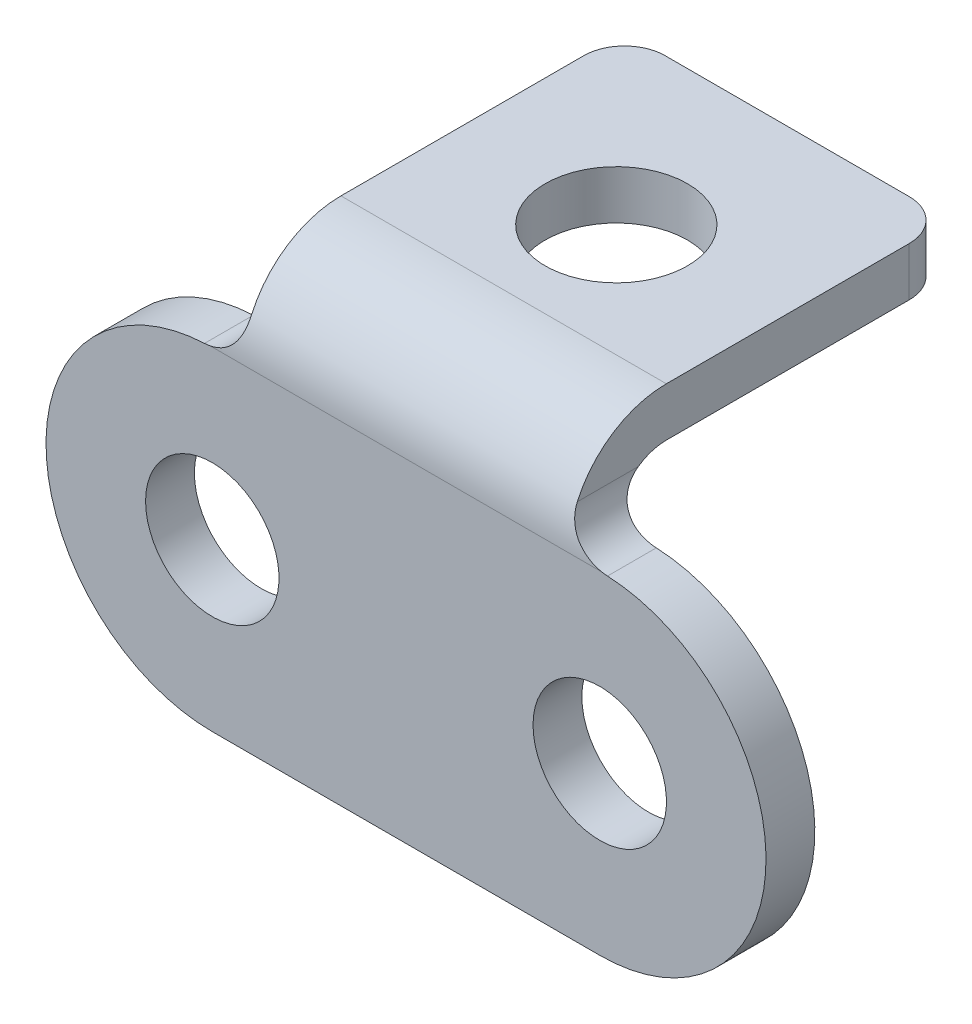
ISO-10303-21;
HEADER;
FILE_DESCRIPTION(('STEP AP214'),'2;1');
FILE_NAME('part.step','',(''),(''),'','','');
FILE_SCHEMA(('AUTOMOTIVE_DESIGN { 1 0 10303 214 1 1 1 1 }'));
ENDSEC;
DATA;
#1=APPLICATION_CONTEXT('core data for automotive mechanical design processes');
#2=APPLICATION_PROTOCOL_DEFINITION('international standard','automotive_design',2000,#1);
#3=PRODUCT_CONTEXT('',#1,'mechanical');
#4=PRODUCT('Part','Part','',(#3));
#5=PRODUCT_RELATED_PRODUCT_CATEGORY('part','',(#4));
#6=PRODUCT_DEFINITION_FORMATION('','',#4);
#7=PRODUCT_DEFINITION_CONTEXT('part definition',#1,'design');
#8=PRODUCT_DEFINITION('design','',#6,#7);
#9=PRODUCT_DEFINITION_SHAPE('','',#8);
#10=(LENGTH_UNIT() NAMED_UNIT(*) SI_UNIT(.MILLI.,.METRE.));
#11=(NAMED_UNIT(*) PLANE_ANGLE_UNIT() SI_UNIT($,.RADIAN.));
#12=(NAMED_UNIT(*) SI_UNIT($,.STERADIAN.) SOLID_ANGLE_UNIT());
#13=UNCERTAINTY_MEASURE_WITH_UNIT(LENGTH_MEASURE(1.E-05),#10,'distance_accuracy_value','');
#14=(GEOMETRIC_REPRESENTATION_CONTEXT(3) GLOBAL_UNCERTAINTY_ASSIGNED_CONTEXT((#13)) GLOBAL_UNIT_ASSIGNED_CONTEXT((#10,
#11,#12)) REPRESENTATION_CONTEXT('',''));
#15=CARTESIAN_POINT('',(0.,0.,0.));
#16=DIRECTION('',(0.,0.,1.));
#17=DIRECTION('',(1.,0.,0.));
#18=AXIS2_PLACEMENT_3D('',#15,#16,#17);
#19=CARTESIAN_POINT('',(37.3375,6.5,-18.03));
#20=DIRECTION('',(-1.,0.,0.));
#21=DIRECTION('',(0.,0.,1.));
#22=AXIS2_PLACEMENT_3D('',#19,#20,#21);
#23=PLANE('',#22);
#24=DIRECTION('',(0.,0.,1.));
#25=VECTOR('',#24,1.);
#26=CARTESIAN_POINT('',(37.3375,5.08195336460302,-18.03));
#27=LINE('',#26,#25);
#28=CARTESIAN_POINT('',(37.3375,5.08195336460302,-6.04024091905592));
#29=VERTEX_POINT('',#28);
#30=CARTESIAN_POINT('',(37.3375,5.08195336460302,-4.54007589406738));
#31=VERTEX_POINT('',#30);
#32=EDGE_CURVE('E11',#29,#31,#27,.T.);
#33=ORIENTED_EDGE('',*,*,#32,.F.);
#34=CARTESIAN_POINT('',(37.3375,4.1,-6.73));
#35=DIRECTION('',(-1.,0.,0.));
#36=DIRECTION('',(0.,0.,1.));
#37=AXIS2_PLACEMENT_3D('',#34,#35,#36);
#38=CIRCLE('',#37,1.2);
#39=CARTESIAN_POINT('',(37.3375,5.3,-6.73));
#40=VERTEX_POINT('',#39);
#41=EDGE_CURVE('E190',#29,#40,#38,.T.);
#42=ORIENTED_EDGE('',*,*,#41,.T.);
#43=DIRECTION('',(0.,0.,1.));
#44=VECTOR('',#43,1.);
#45=CARTESIAN_POINT('',(37.3375,5.3,-13.7));
#46=LINE('',#45,#44);
#47=CARTESIAN_POINT('',(37.3375,5.3,-12.7));
#48=VERTEX_POINT('',#47);
#49=EDGE_CURVE('E168',#48,#40,#46,.T.);
#50=ORIENTED_EDGE('',*,*,#49,.F.);
#51=DIRECTION('',(0.,-1.,0.));
#52=VECTOR('',#51,1.);
#53=CARTESIAN_POINT('',(37.3375,6.5,-12.7));
#54=LINE('',#53,#52);
#55=CARTESIAN_POINT('',(37.3375,6.5,-12.7));
#56=VERTEX_POINT('',#55);
#57=EDGE_CURVE('E430',#56,#48,#54,.T.);
#58=ORIENTED_EDGE('',*,*,#57,.F.);
#59=DIRECTION('',(0.,0.,1.));
#60=VECTOR('',#59,1.);
#61=CARTESIAN_POINT('',(37.3375,6.5,-18.03));
#62=LINE('',#61,#60);
#63=CARTESIAN_POINT('',(37.3375,6.5,-6.73));
#64=VERTEX_POINT('',#63);
#65=EDGE_CURVE('E217',#56,#64,#62,.T.);
#66=ORIENTED_EDGE('',*,*,#65,.T.);
#67=CARTESIAN_POINT('',(37.3375,4.1,-6.73));
#68=DIRECTION('',(-1.,0.,0.));
#69=DIRECTION('',(0.,0.,1.));
#70=AXIS2_PLACEMENT_3D('',#67,#68,#69);
#71=CIRCLE('',#70,2.4);
#72=EDGE_CURVE('E197',#31,#64,#71,.T.);
#73=ORIENTED_EDGE('',*,*,#72,.F.);
#74=EDGE_LOOP('',(#33,#42,#50,#58,#66,#73));
#75=FACE_BOUND('',#74,.T.);
#76=ADVANCED_FACE('F16',(#75),#23,.F.);
#77=CARTESIAN_POINT('',(38.3375,5.08195336460302,-18.03));
#78=DIRECTION('',(0.,0.,-1.));
#79=DIRECTION('',(1.,0.,0.));
#80=AXIS2_PLACEMENT_3D('',#77,#78,#79);
#81=CYLINDRICAL_SURFACE('',#80,1.);
#82=ORIENTED_EDGE('',*,*,#32,.T.);
#83=CARTESIAN_POINT('',(37.3375,5.08195336460302,-4.54007589406738));
#84=CARTESIAN_POINT('',(37.3374996973991,5.06906405721855,-4.5342962223887));
#85=CARTESIAN_POINT('',(37.3377491940562,5.05611595640548,-4.528647029245));
#86=CARTESIAN_POINT('',(37.3387608609191,5.03008658764226,-4.51759112880695));
#87=CARTESIAN_POINT('',(37.3395247020527,5.01700502295884,-4.51218527329103));
#88=CARTESIAN_POINT('',(37.3415820415878,4.99072973420558,-4.50161603465415));
#89=CARTESIAN_POINT('',(37.3428774650514,4.97753577497007,-4.49645360964719));
#90=CARTESIAN_POINT('',(37.3460137847147,4.95105832170342,-4.48637110176577));
#91=CARTESIAN_POINT('',(37.3478568606397,4.93777468120795,-4.48145208070424));
#92=CARTESIAN_POINT('',(37.3521036118509,4.911141780993,-4.47185628480021));
#93=CARTESIAN_POINT('',(37.3545097215617,4.89779249004755,-4.46718067289324));
#94=CARTESIAN_POINT('',(37.3598967262858,4.87105357615684,-4.45807159356169));
#95=CARTESIAN_POINT('',(37.3628803072728,4.85766406440438,-4.45363938702716));
#96=CARTESIAN_POINT('',(37.3694354413794,4.83087133150614,-4.44501702247237));
#97=CARTESIAN_POINT('',(37.3730099264246,4.81746839110454,-4.44082821978433));
#98=CARTESIAN_POINT('',(37.3807589425511,4.79067674628369,-4.43269256924296));
#99=CARTESIAN_POINT('',(37.3849366432181,4.77728851912609,-4.42874716728435));
#100=CARTESIAN_POINT('',(37.3939029500898,4.75055554122746,-4.42109823136776));
#101=CARTESIAN_POINT('',(37.3986949526312,4.73721149077756,-4.41739622970685));
#102=CARTESIAN_POINT('',(37.4088994002627,4.71059737034304,-4.41023400156694));
#103=CARTESIAN_POINT('',(37.4143154549227,4.69732824951201,-4.40677538929229));
#104=CARTESIAN_POINT('',(37.4257761163996,4.67089571198451,-4.40009989001131));
#105=CARTESIAN_POINT('',(37.431824529977,4.65773351819093,-4.39688469471324));
#106=CARTESIAN_POINT('',(37.4445564718395,4.63154774326279,-4.39069583950371));
#107=CARTESIAN_POINT('',(37.4512439854982,4.61852568260414,-4.38772394304087));
#108=CARTESIAN_POINT('',(37.4652590736037,4.59265416061496,-4.3820220457293));
#109=CARTESIAN_POINT('',(37.4725907913668,4.57980653944685,-4.37929387888681));
#110=CARTESIAN_POINT('',(37.487897356661,4.55431908626955,-4.37407774985145));
#111=CARTESIAN_POINT('',(37.4958764814592,4.54168143599784,-4.37159167251528));
#112=CARTESIAN_POINT('',(37.5124795136618,4.51664952770522,-4.36686579318819));
#113=CARTESIAN_POINT('',(37.5211078103676,4.50425780785585,-4.36462797932352));
#114=CARTESIAN_POINT('',(37.5390071644361,4.47975639670014,-4.36037543008516));
#115=CARTESIAN_POINT('',(37.5482826828944,4.46764963347198,-4.35836255693414));
#116=CARTESIAN_POINT('',(37.5637052301297,4.44844778968799,-4.35537757067546));
#117=CARTESIAN_POINT('',(37.5696748023985,4.44122532646264,-4.35430402140324));
#118=CARTESIAN_POINT('',(37.5822723426644,4.42641350057514,-4.35222574986562));
#119=CARTESIAN_POINT('',(37.5889164211071,4.4188362912079,-4.35123191948807));
#120=CARTESIAN_POINT('',(37.6029032667057,4.40336382144328,-4.34930077310651));
#121=CARTESIAN_POINT('',(37.6102626580143,4.39548253290462,-4.34837204619443));
#122=CARTESIAN_POINT('',(37.6257223217862,4.37945470246143,-4.3465763210239));
#123=CARTESIAN_POINT('',(37.6338397643776,4.37132383912001,-4.3457171678245));
#124=CARTESIAN_POINT('',(37.6508570105788,4.35485641073106,-4.34406031983187));
#125=CARTESIAN_POINT('',(37.6597743944715,4.34653731919383,-4.34326952142754));
#126=CARTESIAN_POINT('',(37.6784321594206,4.3297593229954,-4.34175053196379));
#127=CARTESIAN_POINT('',(37.6881904167751,4.32131973362927,-4.34102852709819));
#128=CARTESIAN_POINT('',(37.7085687467369,4.30437346867442,-4.33964769213878));
#129=CARTESIAN_POINT('',(37.7192068481031,4.29588801581417,-4.33899441816961));
#130=CARTESIAN_POINT('',(37.7413810332253,4.27892976126298,-4.33775165032335));
#131=CARTESIAN_POINT('',(37.7529351402625,4.27048015204338,-4.33716717899792));
#132=CARTESIAN_POINT('',(37.7769738703768,4.2536805239499,-4.33606250272444));
#133=CARTESIAN_POINT('',(37.7894763352889,4.24535572770696,-4.3355468573742));
#134=CARTESIAN_POINT('',(37.8154396353933,4.22889995346314,-4.33458026507325));
#135=CARTESIAN_POINT('',(37.8289179383359,4.22079628212176,-4.334133475704));
#136=CARTESIAN_POINT('',(37.8568549584854,4.20488427277453,-4.33330496895582));
#137=CARTESIAN_POINT('',(37.8713305600609,4.19710537011953,-4.33292705735343));
#138=CARTESIAN_POINT('',(37.9012772057827,4.18195157512225,-4.33223663620648));
#139=CARTESIAN_POINT('',(37.9167643253952,4.17460827882029,-4.33192762313988));
#140=CARTESIAN_POINT('',(37.9487407529076,4.16044130252113,-4.33137528424527));
#141=CARTESIAN_POINT('',(37.9652450864807,4.15365139666839,-4.3311351812491));
#142=CARTESIAN_POINT('',(37.9992530573989,4.14071324664489,-4.33072093784856));
#143=CARTESIAN_POINT('',(38.0167704142487,4.13460095021264,-4.33054977817493));
#144=CARTESIAN_POINT('',(38.0527906221591,4.12314624973234,-4.33027357721504));
#145=CARTESIAN_POINT('',(38.0713056196778,4.11784195363584,-4.3301712972412));
#146=CARTESIAN_POINT('',(38.1092946749021,4.10813560847035,-4.33003334792781));
#147=CARTESIAN_POINT('',(38.1287790157694,4.1037737406812,-4.33000025662574));
#148=CARTESIAN_POINT('',(38.1483767868695,4.1,-4.33));
#149=B_SPLINE_CURVE_WITH_KNOTS('',3,(#83,#84,#85,#86,#87,#88,#89,#90,#91,#92,#93,#94,#95,#96,
#97,#98,#99,#100,#101,#102,#103,#104,#105,#106,#107,#108,#109,#110,#111,#112,#113,#114,#115,
#116,#117,#118,#119,#120,#121,#122,#123,#124,#125,#126,#127,#128,#129,#130,#131,#132,#133,#134,
#135,#136,#137,#138,#139,#140,#141,#142,#143,#144,#145,#146,#147,#148),.UNSPECIFIED.,.F.,.F.,(4,
2,2,2,2,2,2,2,2,2,2,2,2,2,2,2,2,2,2,2,2,2,2,2,2,2,2,2,2,2,2,2,4),(0.,0.0423749285428994,
0.0848881870294179,0.127556780281232,0.170397528058938,0.213427048153157,0.25666174059294,
0.300117773024002,0.343811067295968,0.387757287284385,0.431971827960584,0.476469805710315,
0.521266049890743,0.566375095605169,0.611811177665525,0.657588225704567,0.70371986039276,
0.732009982734578,0.762383610428787,0.794846419777004,0.829403048988322,0.866057332776642,
0.904812474487893,0.945671174599992,0.988635728159306,1.03370809970899,1.08088998164802,
1.13018284021527,1.18158795210891,1.23510643393302,1.29073926608892,1.34848731232003,
1.40835133582318),.UNSPECIFIED.);
#150=CARTESIAN_POINT('',(38.1483767868695,4.1,-4.33));
#151=VERTEX_POINT('',#150);
#152=EDGE_CURVE('E329',#31,#151,#149,.T.);
#153=ORIENTED_EDGE('',*,*,#152,.T.);
#154=CARTESIAN_POINT('',(38.3375,5.08195336460302,-4.33));
#155=DIRECTION('',(0.,0.,-1.));
#156=DIRECTION('',(-1.,0.,0.));
#157=AXIS2_PLACEMENT_3D('',#154,#155,#156);
#158=CIRCLE('',#157,1.);
#159=CARTESIAN_POINT('',(38.2908169322665,4.08304361333067,-4.33));
#160=VERTEX_POINT('',#159);
#161=EDGE_CURVE('E264',#160,#151,#158,.T.);
#162=ORIENTED_EDGE('',*,*,#161,.F.);
#163=DIRECTION('',(0.,0.,1.));
#164=VECTOR('',#163,1.);
#165=CARTESIAN_POINT('',(38.2908169322665,4.08304361333067,-18.03));
#166=LINE('',#165,#164);
#167=CARTESIAN_POINT('',(38.2908169322665,4.08304361333067,-5.53));
#168=VERTEX_POINT('',#167);
#169=EDGE_CURVE('E211',#168,#160,#166,.T.);
#170=ORIENTED_EDGE('',*,*,#169,.F.);
#171=CARTESIAN_POINT('',(38.3375,5.08195336460302,-5.53));
#172=DIRECTION('',(0.,0.,-1.));
#173=DIRECTION('',(0.,1.,0.));
#174=AXIS2_PLACEMENT_3D('',#171,#172,#173);
#175=CIRCLE('',#174,1.);
#176=CARTESIAN_POINT('',(38.1483767868695,4.1,-5.53));
#177=VERTEX_POINT('',#176);
#178=EDGE_CURVE('E175',#168,#177,#175,.T.);
#179=ORIENTED_EDGE('',*,*,#178,.T.);
#180=CARTESIAN_POINT('',(37.3375,5.08195336460302,-6.04024091905593));
#181=CARTESIAN_POINT('',(37.3375005865883,5.07105848050952,-6.02472929654194));
#182=CARTESIAN_POINT('',(37.3377324115394,5.05979417986858,-6.00947605278365));
#183=CARTESIAN_POINT('',(37.3386853080608,5.03685158942023,-5.97989990576452));
#184=CARTESIAN_POINT('',(37.3393941467266,5.02519041110512,-5.96556332644786));
#185=CARTESIAN_POINT('',(37.3413006554633,5.0015312213631,-5.93780946128447));
#186=CARTESIAN_POINT('',(37.3424858587477,4.9895485747764,-5.924378231615));
#187=CARTESIAN_POINT('',(37.3453455205969,4.96532117293338,-5.89841916526716));
#188=CARTESIAN_POINT('',(37.3470073061036,4.95308999297588,-5.8858772688395));
#189=CARTESIAN_POINT('',(37.3508202761959,4.92843586716751,-5.86167683113589));
#190=CARTESIAN_POINT('',(37.3529586480234,4.91602471974523,-5.85000425959707));
#191=CARTESIAN_POINT('',(37.357724927606,4.89107701036142,-5.82751875780691));
#192=CARTESIAN_POINT('',(37.3603399559695,4.87855048424908,-5.81669197108341));
#193=CARTESIAN_POINT('',(37.3660595904246,4.85343421639884,-5.79587114887218));
#194=CARTESIAN_POINT('',(37.3691513395947,4.84085277996967,-5.78586357191326));
#195=CARTESIAN_POINT('',(37.3758243678718,4.81568476681536,-5.76665156375046));
#196=CARTESIAN_POINT('',(37.3793929158667,4.80310481333488,-5.75743404376635));
#197=CARTESIAN_POINT('',(37.3870193798879,4.77799373496137,-5.73977026726667));
#198=CARTESIAN_POINT('',(37.3910648086391,4.76546761985401,-5.73131150762922));
#199=CARTESIAN_POINT('',(37.3996447608289,4.74051414764841,-5.71513150943699));
#200=CARTESIAN_POINT('',(37.4041671718119,4.72809027796722,-5.70739848002039));
#201=CARTESIAN_POINT('',(37.4137006319242,4.70338722708816,-5.69263471456062));
#202=CARTESIAN_POINT('',(37.4187000866547,4.69111012833905,-5.68559301842812));
#203=CARTESIAN_POINT('',(37.4291871945416,4.66674277921686,-5.67217561615306));
#204=CARTESIAN_POINT('',(37.4346639179318,4.65465334907107,-5.66578988734188));
#205=CARTESIAN_POINT('',(37.4461043707082,4.6306993613657,-5.65364720772937));
#206=CARTESIAN_POINT('',(37.4520579978101,4.61883454264007,-5.64788126740417));
#207=CARTESIAN_POINT('',(37.464453083593,4.59536552711423,-5.63694097919118));
#208=CARTESIAN_POINT('',(37.4708853799885,4.58376016908151,-5.63175874278178));
#209=CARTESIAN_POINT('',(37.4842305635714,4.56083737265123,-5.62194673502916));
#210=CARTESIAN_POINT('',(37.4911354812212,4.54951817694782,-5.61731025690194));
#211=CARTESIAN_POINT('',(37.5054474466195,4.52720975266503,-5.6085572151849));
#212=CARTESIAN_POINT('',(37.5128474637027,4.51621819350492,-5.60443507367007));
#213=CARTESIAN_POINT('',(37.5296574450734,4.4922690700007,-5.59584069389036));
#214=CARTESIAN_POINT('',(37.5391749637117,4.47935393946035,-5.59146116501471));
#215=CARTESIAN_POINT('',(37.5586767275259,4.45401792219475,-5.58333298744111));
#216=CARTESIAN_POINT('',(37.5686514141635,4.44159247293994,-5.57957558780936));
#217=CARTESIAN_POINT('',(37.589093038291,4.41728506037996,-5.57263750245437));
#218=CARTESIAN_POINT('',(37.5995515235942,4.40539802758377,-5.56944972280021));
#219=CARTESIAN_POINT('',(37.620952113806,4.38219041028102,-5.56359092064408));
#220=CARTESIAN_POINT('',(37.631887467712,4.37086496324978,-5.56091449635717));
#221=CARTESIAN_POINT('',(37.6542419728143,4.34880439208979,-5.55602259999871));
#222=CARTESIAN_POINT('',(37.6656560143386,4.33806494702842,-5.55380327549249));
#223=CARTESIAN_POINT('',(37.6889657008852,4.31719459854231,-5.54977173090808));
#224=CARTESIAN_POINT('',(37.7008578940625,4.30706031431039,-5.54795705557359));
#225=CARTESIAN_POINT('',(37.7251223302756,4.28741513268255,-5.5446838413663));
#226=CARTESIAN_POINT('',(37.7374927062667,4.27790213729634,-5.54322405318047));
#227=CARTESIAN_POINT('',(37.7627118804669,4.2595109655029,-5.54061256900007));
#228=CARTESIAN_POINT('',(37.7755602695673,4.2506322644129,-5.53946061615315));
#229=CARTESIAN_POINT('',(37.8017340335749,4.23351827208645,-5.53741990028186));
#230=CARTESIAN_POINT('',(37.8150602770954,4.22528424918848,-5.53653164693166));
#231=CARTESIAN_POINT('',(37.8421885016079,4.20946576391798,-5.53497668826272));
#232=CARTESIAN_POINT('',(37.8559924079764,4.20188450281663,-5.53431103322666));
#233=CARTESIAN_POINT('',(37.8840749479823,4.1873756828105,-5.5331629825576));
#234=CARTESIAN_POINT('',(37.898356316752,4.18045331459699,-5.53268196389156));
#235=CARTESIAN_POINT('',(37.9273930350584,4.16726480125818,-5.53186831578657));
#236=CARTESIAN_POINT('',(37.9421516726641,4.16100581205905,-5.53153719873428));
#237=CARTESIAN_POINT('',(37.9721424217064,4.14914534909203,-5.53099189896257));
#238=CARTESIAN_POINT('',(37.9873781227963,4.14355290058387,-5.53077920322703));
#239=CARTESIAN_POINT('',(38.0183228339156,4.13302581740285,-5.53044283611062));
#240=CARTESIAN_POINT('',(38.0340355045395,4.12810192119342,-5.53032050312862));
#241=CARTESIAN_POINT('',(38.0659338757137,4.11891189647762,-5.53014001770664));
#242=CARTESIAN_POINT('',(38.0821230998427,4.11465802562399,-5.53008296286789));
#243=CARTESIAN_POINT('',(38.1149758050224,4.10680652564628,-5.530013027532));
#244=CARTESIAN_POINT('',(38.1316425288745,4.1032224282545,-5.5300009801096));
#245=CARTESIAN_POINT('',(38.1483767868695,4.1,-5.53));
#246=B_SPLINE_CURVE_WITH_KNOTS('',3,(#180,#181,#182,#183,#184,#185,#186,#187,#188,#189,#190,
#191,#192,#193,#194,#195,#196,#197,#198,#199,#200,#201,#202,#203,#204,#205,#206,#207,#208,#209,
#210,#211,#212,#213,#214,#215,#216,#217,#218,#219,#220,#221,#222,#223,#224,#225,#226,#227,#228,
#229,#230,#231,#232,#233,#234,#235,#236,#237,#238,#239,#240,#241,#242,#243,#244,#245),
.UNSPECIFIED.,.F.,.F.,(4,2,2,2,2,2,2,2,2,2,2,2,2,2,2,2,2,2,2,2,2,2,2,2,2,2,2,2,2,2,2,2,4),(0.,
0.0568608449047428,0.112316423025065,0.166406462578889,0.219173778354122,0.27066448695511,
0.320928221090741,0.37001833735853,0.417992110547529,0.464910905967223,0.510840319811442,
0.555850276234948,0.600015068853964,0.643413334020837,0.686127943727474,0.728245807605651,
0.76985757638785,0.819722223832055,0.86881150342095,0.917238792489661,0.965122175409917,
1.01258380069949,1.05974909783794,1.10674587279356,1.15370331115997,1.20075092590532,
1.24801749182036,1.29563000999681,1.34371274286763,1.3923863539563,1.44176717752219,
1.49196663306964,1.54309078954614),.UNSPECIFIED.);
#247=EDGE_CURVE('E272',#29,#177,#246,.T.);
#248=ORIENTED_EDGE('',*,*,#247,.F.);
#249=EDGE_LOOP('',(#82,#153,#162,#170,#179,#248));
#250=FACE_BOUND('',#249,.T.);
#251=ADVANCED_FACE('F245',(#250),#81,.F.);
#252=CARTESIAN_POINT('',(28.3375,5.08195336460302,-18.03));
#253=DIRECTION('',(0.,0.,-1.));
#254=DIRECTION('',(1.,0.,0.));
#255=AXIS2_PLACEMENT_3D('',#252,#253,#254);
#256=CYLINDRICAL_SURFACE('',#255,1.);
#257=CARTESIAN_POINT('',(28.3375,5.08195336460302,-5.53));
#258=DIRECTION('',(0.,0.,-1.));
#259=DIRECTION('',(0.,1.,0.));
#260=AXIS2_PLACEMENT_3D('',#257,#258,#259);
#261=CIRCLE('',#260,1.);
#262=CARTESIAN_POINT('',(28.5266232131305,4.1,-5.53));
#263=VERTEX_POINT('',#262);
#264=CARTESIAN_POINT('',(28.3841830466831,4.0830436123469,-5.53));
#265=VERTEX_POINT('',#264);
#266=EDGE_CURVE('E174',#263,#265,#261,.T.);
#267=ORIENTED_EDGE('',*,*,#266,.T.);
#268=DIRECTION('',(0.,0.,1.));
#269=VECTOR('',#268,1.);
#270=CARTESIAN_POINT('',(28.3841830466831,4.0830436123469,-18.03));
#271=LINE('',#270,#269);
#272=CARTESIAN_POINT('',(28.3841830466831,4.0830436123469,-4.33));
#273=VERTEX_POINT('',#272);
#274=EDGE_CURVE('E186',#265,#273,#271,.T.);
#275=ORIENTED_EDGE('',*,*,#274,.T.);
#276=CARTESIAN_POINT('',(28.3375,5.08195336460302,-4.33));
#277=DIRECTION('',(0.,0.,-1.));
#278=DIRECTION('',(-1.,0.,0.));
#279=AXIS2_PLACEMENT_3D('',#276,#277,#278);
#280=CIRCLE('',#279,1.);
#281=CARTESIAN_POINT('',(28.5266232131305,4.1,-4.33));
#282=VERTEX_POINT('',#281);
#283=EDGE_CURVE('E359',#282,#273,#280,.T.);
#284=ORIENTED_EDGE('',*,*,#283,.F.);
#285=CARTESIAN_POINT('',(28.5266232131305,4.1,-4.33));
#286=CARTESIAN_POINT('',(28.5462128979668,4.10377218462745,-4.33000025664652));
#287=CARTESIAN_POINT('',(28.5656892463391,4.10813200977534,-4.33003325302542));
#288=CARTESIAN_POINT('',(28.6036619369614,4.11783317389369,-4.33017081565021));
#289=CARTESIAN_POINT('',(28.6221685666172,4.12313431073594,-4.33027280737517));
#290=CARTESIAN_POINT('',(28.658171756928,4.13458156148107,-4.33054823496768));
#291=CARTESIAN_POINT('',(28.6756804676265,4.14068954916782,-4.33071891303001));
#292=CARTESIAN_POINT('',(28.7096709572397,4.15361793083715,-4.3311319963827));
#293=CARTESIAN_POINT('',(28.7261664582797,4.16040236122046,-4.33137142438109));
#294=CARTESIAN_POINT('',(28.7581251184844,4.1745572281593,-4.33192221654171));
#295=CARTESIAN_POINT('',(28.7736033047075,4.18189387694153,-4.33223036119522));
#296=CARTESIAN_POINT('',(28.8035320603955,4.19703322225013,-4.33291884892307));
#297=CARTESIAN_POINT('',(28.8179987052455,4.20480431115603,-4.33329569865656));
#298=CARTESIAN_POINT('',(28.845917858698,4.22069955184419,-4.33412188529575));
#299=CARTESIAN_POINT('',(28.8593872499276,4.22879425856249,-4.33456741928532));
#300=CARTESIAN_POINT('',(28.8853328333966,4.24523098420119,-4.33553130479079));
#301=CARTESIAN_POINT('',(28.8978264898256,4.25354568843944,-4.33604550118741));
#302=CARTESIAN_POINT('',(28.9218477590848,4.27032404185965,-4.33714708395519));
#303=CARTESIAN_POINT('',(28.9333932082456,4.27876246191236,-4.33772991263354));
#304=CARTESIAN_POINT('',(28.9555502717806,4.29569728169792,-4.33896920032829));
#305=CARTESIAN_POINT('',(28.9661799018971,4.3041704838358,-4.33962063791884));
#306=CARTESIAN_POINT('',(28.9865415100059,4.32109122947407,-4.34099760584034));
#307=CARTESIAN_POINT('',(28.9962915071236,4.32951754636598,-4.3417175801285));
#308=CARTESIAN_POINT('',(29.014932986818,4.3462680213382,-4.34323231645689));
#309=CARTESIAN_POINT('',(29.023842333949,4.35457286139471,-4.34402089085893));
#310=CARTESIAN_POINT('',(29.0408437449408,4.37101085467436,-4.34567309692824));
#311=CARTESIAN_POINT('',(29.0489533752208,4.37912653271902,-4.34652982902093));
#312=CARTESIAN_POINT('',(29.0643976427238,4.39512310449593,-4.34832053243259));
#313=CARTESIAN_POINT('',(29.0717494342505,4.40298831915143,-4.34924665186436));
#314=CARTESIAN_POINT('',(29.0857212911606,4.41842780202086,-4.35117236694091));
#315=CARTESIAN_POINT('',(29.092357962706,4.42598809871763,-4.35216336613533));
#316=CARTESIAN_POINT('',(29.1049408574957,4.44076529488115,-4.35423589419847));
#317=CARTESIAN_POINT('',(29.1109031724544,4.44797004374904,-4.35530650700815));
#318=CARTESIAN_POINT('',(29.1263403682237,4.46716511067408,-4.35828941215878));
#319=CARTESIAN_POINT('',(29.1356366417521,4.47928382656555,-4.36030384335759));
#320=CARTESIAN_POINT('',(29.1535753506497,4.50380976831008,-4.36455933367672));
#321=CARTESIAN_POINT('',(29.1622222963967,4.51621402893851,-4.36679851468539));
#322=CARTESIAN_POINT('',(29.1788605155723,4.54127140790763,-4.37152722267619));
#323=CARTESIAN_POINT('',(29.1868562287572,4.5539219549554,-4.37401474146268));
#324=CARTESIAN_POINT('',(29.2021939398051,4.57943539087956,-4.37923377778138));
#325=CARTESIAN_POINT('',(29.2095402659951,4.59229606858252,-4.38196339079719));
#326=CARTESIAN_POINT('',(29.2235826280251,4.61819370032086,-4.38766822388282));
#327=CARTESIAN_POINT('',(29.2302828586308,4.63122878848872,-4.39064158955052));
#328=CARTESIAN_POINT('',(29.2430383929415,4.65744043818498,-4.39683342221153));
#329=CARTESIAN_POINT('',(29.2490977335626,4.67061545718306,-4.40005010498467));
#330=CARTESIAN_POINT('',(29.2605785192456,4.69707330183007,-4.40672861995887));
#331=CARTESIAN_POINT('',(29.2660038224401,4.71035488610068,-4.41018873927973));
#332=CARTESIAN_POINT('',(29.2762251579249,4.73699344171342,-4.41735402228567));
#333=CARTESIAN_POINT('',(29.281024850729,4.75034944890794,-4.42105755027745));
#334=CARTESIAN_POINT('',(29.2900050571384,4.77710571476266,-4.42870958001864));
#335=CARTESIAN_POINT('',(29.294189017353,4.79050526150534,-4.43265652772754));
#336=CARTESIAN_POINT('',(29.3019492060509,4.81731880073043,-4.44079531113986));
#337=CARTESIAN_POINT('',(29.3055286534917,4.83073230756087,-4.44498567902535));
#338=CARTESIAN_POINT('',(29.3120925052492,4.85754532379415,-4.45361121550732));
#339=CARTESIAN_POINT('',(29.315079889749,4.87094454715054,-4.45804500674623));
#340=CARTESIAN_POINT('',(29.3204734374366,4.89770194424085,-4.46715729709047));
#341=CARTESIAN_POINT('',(29.3228823335445,4.9110600044042,-4.47183451326047));
#342=CARTESIAN_POINT('',(29.3271337390268,4.93770942655583,-4.48143355929316));
#343=CARTESIAN_POINT('',(29.3289787282843,4.95100082013953,-4.48635420424013));
#344=CARTESIAN_POINT('',(29.3321181031869,4.97749270018389,-4.4964400013744));
#345=CARTESIAN_POINT('',(29.3334147123671,4.99069333603381,-4.50160406992204));
#346=CARTESIAN_POINT('',(29.3354737987771,5.01698084905404,-4.51217663702742));
#347=CARTESIAN_POINT('',(29.3362382431049,5.03006796667357,-4.5175841558838));
#348=CARTESIAN_POINT('',(29.3372506401899,5.05610727496375,-4.52864342379405));
#349=CARTESIAN_POINT('',(29.3375003039804,5.06905976978138,-4.53429429982092));
#350=CARTESIAN_POINT('',(29.3375,5.08195336460302,-4.54007589406738));
#351=B_SPLINE_CURVE_WITH_KNOTS('',3,(#285,#286,#287,#288,#289,#290,#291,#292,#293,#294,#295,
#296,#297,#298,#299,#300,#301,#302,#303,#304,#305,#306,#307,#308,#309,#310,#311,#312,#313,#314,
#315,#316,#317,#318,#319,#320,#321,#322,#323,#324,#325,#326,#327,#328,#329,#330,#331,#332,#333,
#334,#335,#336,#337,#338,#339,#340,#341,#342,#343,#344,#345,#346,#347,#348,#349,#350),
.UNSPECIFIED.,.F.,.F.,(4,2,2,2,2,2,2,2,2,2,2,2,2,2,2,2,2,2,2,2,2,2,2,2,2,2,2,2,2,2,2,2,4),(0.,
0.0598393309468778,0.117560675154595,0.173164791602069,0.226652539481541,0.278024894280113,
0.327282967294079,0.374428029490921,0.419461540930083,0.462385187364414,0.503200926221208,
0.54191104498458,0.578518236192562,0.613025695018852,0.64543724804694,0.675757525888825,
0.703992198643882,0.750190131106043,0.796029894597852,0.841525109739409,0.886689708975428,
0.931537932976062,0.976084325929609,1.02034372968014,1.06433127666995,1.10806238165476,
1.15155273216875,1.19481827772688,1.23787521776318,1.28073998831589,1.32342924748323,
1.36595985968701,1.40834887879506),.UNSPECIFIED.);
#352=CARTESIAN_POINT('',(29.3375,5.08195336460302,-4.54007589406738));
#353=VERTEX_POINT('',#352);
#354=EDGE_CURVE('E181',#282,#353,#351,.T.);
#355=ORIENTED_EDGE('',*,*,#354,.T.);
#356=DIRECTION('',(0.,0.,1.));
#357=VECTOR('',#356,1.);
#358=CARTESIAN_POINT('',(29.3375,5.08195336460302,-18.03));
#359=LINE('',#358,#357);
#360=CARTESIAN_POINT('',(29.3375,5.08195336460302,-6.04024091905593));
#361=VERTEX_POINT('',#360);
#362=EDGE_CURVE('E26',#361,#353,#359,.T.);
#363=ORIENTED_EDGE('',*,*,#362,.F.);
#364=CARTESIAN_POINT('',(28.5266232131305,4.1,-5.53));
#365=CARTESIAN_POINT('',(28.5433487735526,4.10322076660013,-5.53000097672895));
#366=CARTESIAN_POINT('',(28.5600070100596,4.10680210980166,-5.53001301402284));
#367=CARTESIAN_POINT('',(28.5928420745373,4.1146458045943,-5.53008282763334));
#368=CARTESIAN_POINT('',(28.6090221498978,4.11889459920149,-5.53013976885881));
#369=CARTESIAN_POINT('',(28.6409015581244,4.1280721769792,-5.53031983074826));
#370=CARTESIAN_POINT('',(28.6566044232095,4.13298866288266,-5.5304418505304));
#371=CARTESIAN_POINT('',(28.6875288524612,4.14349865711559,-5.5307772727429));
#372=CARTESIAN_POINT('',(28.7027540920547,4.14908137279226,-5.53098933117384));
#373=CARTESIAN_POINT('',(28.7327232409684,4.16092012801715,-5.5315328950819));
#374=CARTESIAN_POINT('',(28.7474707628066,4.16716707440331,-5.53186290440475));
#375=CARTESIAN_POINT('',(28.7764845639688,4.18032929408796,-5.53267371125413));
#376=CARTESIAN_POINT('',(28.7907541639033,4.18723733150614,-5.53315298220698));
#377=CARTESIAN_POINT('',(28.8188124706714,4.20171532343626,-5.53429672630497));
#378=CARTESIAN_POINT('',(28.8326039560193,4.20927999776864,-5.5349598017757));
#379=CARTESIAN_POINT('',(28.8597066318853,4.22506319425482,-5.53650858446329));
#380=CARTESIAN_POINT('',(28.8730198025279,4.23327841936596,-5.5373932127256));
#381=CARTESIAN_POINT('',(28.8991667029265,4.25035276373279,-5.53942543614686));
#382=CARTESIAN_POINT('',(28.9120013671709,4.2592105163775,-5.54057248374463));
#383=CARTESIAN_POINT('',(28.9371923625644,4.27755781638552,-5.54317267090226));
#384=CARTESIAN_POINT('',(28.9495483605713,4.28704779169924,-5.54462601926632));
#385=CARTESIAN_POINT('',(28.9737833034404,4.30664505224334,-5.54788460469727));
#386=CARTESIAN_POINT('',(28.9856604655623,4.31675434426051,-5.54969103230173));
#387=CARTESIAN_POINT('',(29.0089393398957,4.33757294641818,-5.55370405447972));
#388=CARTESIAN_POINT('',(29.0203376905127,4.3482855553916,-5.5559130346714));
#389=CARTESIAN_POINT('',(29.0426600776973,4.37029082201137,-5.56078191694869));
#390=CARTESIAN_POINT('',(29.0535790983844,4.38158773078777,-5.56344559115892));
#391=CARTESIAN_POINT('',(29.0749462106741,4.40473685469595,-5.56927627780107));
#392=CARTESIAN_POINT('',(29.0853876445643,4.41659387792443,-5.57244860193471));
#393=CARTESIAN_POINT('',(29.1057946329332,4.44083988998586,-5.57935277901269));
#394=CARTESIAN_POINT('',(29.1157518309889,4.45323390752445,-5.5830916256227));
#395=CARTESIAN_POINT('',(29.1352170228824,4.47850657409039,-5.59117962422549));
#396=CARTESIAN_POINT('',(29.1447155300475,4.49138977429221,-5.59553742335918));
#397=CARTESIAN_POINT('',(29.1615352899318,4.51533830219788,-5.60410978067733));
#398=CARTESIAN_POINT('',(29.1689608649182,4.52636234899871,-5.60823443514599));
#399=CARTESIAN_POINT('',(29.1833227835126,4.54873378112559,-5.61699336671746));
#400=CARTESIAN_POINT('',(29.1902522165701,4.56008345643039,-5.62163314716992));
#401=CARTESIAN_POINT('',(29.2036444752269,4.58306566708537,-5.63145277104698));
#402=CARTESIAN_POINT('',(29.2100994360456,4.59469993929199,-5.63663924986719));
#403=CARTESIAN_POINT('',(29.2225381142986,4.61822505548619,-5.64758893430979));
#404=CARTESIAN_POINT('',(29.2285127752225,4.63011704901888,-5.6533599571259));
#405=CARTESIAN_POINT('',(29.2399935034972,4.65412364527223,-5.6655136636569));
#406=CARTESIAN_POINT('',(29.2454895672983,4.66623850930782,-5.67190526798106));
#407=CARTESIAN_POINT('',(29.256013586808,4.69065493021451,-5.6853352027994));
#408=CARTESIAN_POINT('',(29.2610307043352,4.70295567690012,-5.69238348985458));
#409=CARTESIAN_POINT('',(29.2705977242611,4.72770419164441,-5.70716113048704));
#410=CARTESIAN_POINT('',(29.2751361148598,4.74014989628706,-5.71490138150501));
#411=CARTESIAN_POINT('',(29.2837462709356,4.76514517471145,-5.73109641471272));
#412=CARTESIAN_POINT('',(29.2878059968836,4.77769128763888,-5.73956292883483));
#413=CARTESIAN_POINT('',(29.2954593094179,4.80284047662882,-5.75724269384133));
#414=CARTESIAN_POINT('',(29.2990404715596,4.81543857561988,-5.76646839272861));
#415=CARTESIAN_POINT('',(29.3057369924016,4.84064098404706,-5.78569711567729));
#416=CARTESIAN_POINT('',(29.308839672741,4.85323870776021,-5.79571317711566));
#417=CARTESIAN_POINT('',(29.3145794436963,4.87838565603247,-5.81655119365958));
#418=CARTESIAN_POINT('',(29.3172037203712,4.89092661641619,-5.82738664232824));
#419=CARTESIAN_POINT('',(29.3219867802947,4.91590131539265,-5.84988955392427));
#420=CARTESIAN_POINT('',(29.3241327179052,4.92832506186375,-5.86157082860316));
#421=CARTESIAN_POINT('',(29.3279591120871,4.95300253676789,-5.88578861266344));
#422=CARTESIAN_POINT('',(29.3296267811205,4.96524451227888,-5.89833911042186));
#423=CARTESIAN_POINT('',(29.3324965111535,4.98949170260899,-5.92431516867538));
#424=CARTESIAN_POINT('',(29.3336859165935,5.00148338879925,-5.93775474950116));
#425=CARTESIAN_POINT('',(29.3355991364616,5.02515891723273,-5.96552495293436));
#426=CARTESIAN_POINT('',(29.3363104946367,5.03682744204859,-5.97986948207633));
#427=CARTESIAN_POINT('',(29.3372667501514,5.05978307061864,-6.00946100804231));
#428=CARTESIAN_POINT('',(29.3374994192873,5.07105311077704,-6.02472164541158));
#429=CARTESIAN_POINT('',(29.3375,5.08195336460303,-6.04024091905594));
#430=B_SPLINE_CURVE_WITH_KNOTS('',3,(#364,#365,#366,#367,#368,#369,#370,#371,#372,#373,#374,
#375,#376,#377,#378,#379,#380,#381,#382,#383,#384,#385,#386,#387,#388,#389,#390,#391,#392,#393,
#394,#395,#396,#397,#398,#399,#400,#401,#402,#403,#404,#405,#406,#407,#408,#409,#410,#411,#412,
#413,#414,#415,#416,#417,#418,#419,#420,#421,#422,#423,#424,#425,#426,#427,#428,#429),
.UNSPECIFIED.,.F.,.F.,(4,2,2,2,2,2,2,2,2,2,2,2,2,2,2,2,2,2,2,2,2,2,2,2,2,2,2,2,2,2,2,2,4),(0.,
0.0510976137027484,0.10126674061644,0.150612928601291,0.199247082162565,0.247285035817339,
0.294846978235067,0.342056731439975,0.389040899430699,0.435927910783784,0.482846988839527,
0.529927089601667,0.577295850487599,0.625078592050606,0.673397409927848,0.722370386332401,
0.77211094061425,0.813842989426446,0.856073976868917,0.898894542263721,0.942391637618734,
0.986648225720024,1.03174307589327,1.07775065023713,1.12474107017935,1.17278015151561,
1.22192949550294,1.27224662386088,1.32378514643079,1.37659495152029,1.43072241041742,
1.48621058904789,1.54309946116435),.UNSPECIFIED.);
#431=EDGE_CURVE('E271',#263,#361,#430,.T.);
#432=ORIENTED_EDGE('',*,*,#431,.F.);
#433=EDGE_LOOP('',(#267,#275,#284,#355,#363,#432));
#434=FACE_BOUND('',#433,.T.);
#435=ADVANCED_FACE('F234',(#434),#256,.F.);
#436=CARTESIAN_POINT('',(29.3375,5.08195336460302,-18.03));
#437=DIRECTION('',(1.,0.,0.));
#438=DIRECTION('',(0.,1.,0.));
#439=AXIS2_PLACEMENT_3D('',#436,#437,#438);
#440=PLANE('',#439);
#441=CARTESIAN_POINT('',(29.3375,4.1,-6.73));
#442=DIRECTION('',(1.,0.,0.));
#443=DIRECTION('',(0.,0.,-1.));
#444=AXIS2_PLACEMENT_3D('',#441,#442,#443);
#445=CIRCLE('',#444,1.2);
#446=CARTESIAN_POINT('',(29.3375,5.3,-6.73));
#447=VERTEX_POINT('',#446);
#448=EDGE_CURVE('E275',#447,#361,#445,.T.);
#449=ORIENTED_EDGE('',*,*,#448,.T.);
#450=ORIENTED_EDGE('',*,*,#362,.T.);
#451=CARTESIAN_POINT('',(29.3375,4.1,-6.73));
#452=DIRECTION('',(1.,0.,0.));
#453=DIRECTION('',(0.,0.,-1.));
#454=AXIS2_PLACEMENT_3D('',#451,#452,#453);
#455=CIRCLE('',#454,2.4);
#456=CARTESIAN_POINT('',(29.3375,6.5,-6.73));
#457=VERTEX_POINT('',#456);
#458=EDGE_CURVE('E196',#457,#353,#455,.T.);
#459=ORIENTED_EDGE('',*,*,#458,.F.);
#460=DIRECTION('',(0.,0.,1.));
#461=VECTOR('',#460,1.);
#462=CARTESIAN_POINT('',(29.3375,6.5,-18.03));
#463=LINE('',#462,#461);
#464=CARTESIAN_POINT('',(29.3375,6.5,-12.7));
#465=VERTEX_POINT('',#464);
#466=EDGE_CURVE('E202',#465,#457,#463,.T.);
#467=ORIENTED_EDGE('',*,*,#466,.F.);
#468=DIRECTION('',(0.,-1.,0.));
#469=VECTOR('',#468,1.);
#470=CARTESIAN_POINT('',(29.3375,6.5,-12.7));
#471=LINE('',#470,#469);
#472=CARTESIAN_POINT('',(29.3375,5.3,-12.7));
#473=VERTEX_POINT('',#472);
#474=EDGE_CURVE('E40',#465,#473,#471,.T.);
#475=ORIENTED_EDGE('',*,*,#474,.T.);
#476=DIRECTION('',(0.,0.,-1.));
#477=VECTOR('',#476,1.);
#478=CARTESIAN_POINT('',(29.3375,5.3,-13.7));
#479=LINE('',#478,#477);
#480=EDGE_CURVE('E641',#447,#473,#479,.T.);
#481=ORIENTED_EDGE('',*,*,#480,.F.);
#482=EDGE_LOOP('',(#449,#450,#459,#467,#475,#481));
#483=FACE_BOUND('',#482,.T.);
#484=ADVANCED_FACE('F244',(#483),#440,.F.);
#485=CARTESIAN_POINT('',(38.1,-4.0875,-5.53));
#486=DIRECTION('',(0.,1.,0.));
#487=DIRECTION('',(1.,0.,0.));
#488=AXIS2_PLACEMENT_3D('',#485,#486,#487);
#489=PLANE('',#488);
#490=DIRECTION('',(-1.,0.,0.));
#491=VECTOR('',#490,1.);
#492=CARTESIAN_POINT('',(38.1,-4.0875,-4.33));
#493=LINE('',#492,#491);
#494=CARTESIAN_POINT('',(38.1,-4.0875,-4.33));
#495=VERTEX_POINT('',#494);
#496=CARTESIAN_POINT('',(28.575,-4.0875,-4.33));
#497=VERTEX_POINT('',#496);
#498=EDGE_CURVE('E367',#495,#497,#493,.T.);
#499=ORIENTED_EDGE('',*,*,#498,.T.);
#500=DIRECTION('',(0.,0.,1.));
#501=VECTOR('',#500,1.);
#502=CARTESIAN_POINT('',(28.575,-4.0875,-5.53));
#503=LINE('',#502,#501);
#504=CARTESIAN_POINT('',(28.575,-4.0875,-5.53));
#505=VERTEX_POINT('',#504);
#506=EDGE_CURVE('E201',#505,#497,#503,.T.);
#507=ORIENTED_EDGE('',*,*,#506,.F.);
#508=DIRECTION('',(-1.,0.,0.));
#509=VECTOR('',#508,1.);
#510=CARTESIAN_POINT('',(38.1,-4.0875,-5.53));
#511=LINE('',#510,#509);
#512=CARTESIAN_POINT('',(38.1,-4.0875,-5.53));
#513=VERTEX_POINT('',#512);
#514=EDGE_CURVE('E170',#513,#505,#511,.T.);
#515=ORIENTED_EDGE('',*,*,#514,.F.);
#516=DIRECTION('',(0.,0.,1.));
#517=VECTOR('',#516,1.);
#518=CARTESIAN_POINT('',(38.1,-4.0875,-5.53));
#519=LINE('',#518,#517);
#520=EDGE_CURVE('E212',#513,#495,#519,.T.);
#521=ORIENTED_EDGE('',*,*,#520,.T.);
#522=EDGE_LOOP('',(#499,#507,#515,#521));
#523=FACE_BOUND('',#522,.T.);
#524=ADVANCED_FACE('F305',(#523),#489,.F.);
#525=CARTESIAN_POINT('',(30.3375,6.5,-12.7));
#526=DIRECTION('',(0.,1.,0.));
#527=DIRECTION('',(0.,0.,1.));
#528=AXIS2_PLACEMENT_3D('',#525,#526,#527);
#529=CYLINDRICAL_SURFACE('',#528,1.);
#530=ORIENTED_EDGE('',*,*,#474,.F.);
#531=CARTESIAN_POINT('',(30.3375,6.5,-12.7));
#532=DIRECTION('',(0.,1.,0.));
#533=DIRECTION('',(-1.,0.,0.));
#534=AXIS2_PLACEMENT_3D('',#531,#532,#533);
#535=CIRCLE('',#534,1.);
#536=CARTESIAN_POINT('',(30.3375,6.5,-13.7));
#537=VERTEX_POINT('',#536);
#538=EDGE_CURVE('E206',#537,#465,#535,.T.);
#539=ORIENTED_EDGE('',*,*,#538,.F.);
#540=DIRECTION('',(0.,-1.,0.));
#541=VECTOR('',#540,1.);
#542=CARTESIAN_POINT('',(30.3375,6.5,-13.7));
#543=LINE('',#542,#541);
#544=CARTESIAN_POINT('',(30.3375,5.3,-13.7));
#545=VERTEX_POINT('',#544);
#546=EDGE_CURVE('E180',#537,#545,#543,.T.);
#547=ORIENTED_EDGE('',*,*,#546,.T.);
#548=CARTESIAN_POINT('',(30.3375,5.3,-12.7));
#549=DIRECTION('',(0.,-1.,0.));
#550=DIRECTION('',(0.,0.,-1.));
#551=AXIS2_PLACEMENT_3D('',#548,#549,#550);
#552=CIRCLE('',#551,1.);
#553=EDGE_CURVE('E433',#473,#545,#552,.T.);
#554=ORIENTED_EDGE('',*,*,#553,.F.);
#555=EDGE_LOOP('',(#530,#539,#547,#554));
#556=FACE_BOUND('',#555,.T.);
#557=ADVANCED_FACE('F511',(#556),#529,.T.);
#558=CARTESIAN_POINT('',(36.3375,6.5,-12.7));
#559=DIRECTION('',(0.,1.,0.));
#560=DIRECTION('',(0.,0.,1.));
#561=AXIS2_PLACEMENT_3D('',#558,#559,#560);
#562=CYLINDRICAL_SURFACE('',#561,1.);
#563=DIRECTION('',(0.,-1.,0.));
#564=VECTOR('',#563,1.);
#565=CARTESIAN_POINT('',(36.3375,6.5,-13.7));
#566=LINE('',#565,#564);
#567=CARTESIAN_POINT('',(36.3375,6.5,-13.7));
#568=VERTEX_POINT('',#567);
#569=CARTESIAN_POINT('',(36.3375,5.3,-13.7));
#570=VERTEX_POINT('',#569);
#571=EDGE_CURVE('E429',#568,#570,#566,.T.);
#572=ORIENTED_EDGE('',*,*,#571,.F.);
#573=CARTESIAN_POINT('',(36.3375,6.5,-12.7));
#574=DIRECTION('',(0.,1.,0.));
#575=DIRECTION('',(-1.,0.,0.));
#576=AXIS2_PLACEMENT_3D('',#573,#574,#575);
#577=CIRCLE('',#576,1.);
#578=EDGE_CURVE('E213',#56,#568,#577,.T.);
#579=ORIENTED_EDGE('',*,*,#578,.F.);
#580=ORIENTED_EDGE('',*,*,#57,.T.);
#581=CARTESIAN_POINT('',(36.3375,5.3,-12.7));
#582=DIRECTION('',(0.,-1.,0.));
#583=DIRECTION('',(0.,0.,-1.));
#584=AXIS2_PLACEMENT_3D('',#581,#582,#583);
#585=CIRCLE('',#584,1.);
#586=EDGE_CURVE('E205',#570,#48,#585,.T.);
#587=ORIENTED_EDGE('',*,*,#586,.F.);
#588=EDGE_LOOP('',(#572,#579,#580,#587));
#589=FACE_BOUND('',#588,.T.);
#590=ADVANCED_FACE('F395',(#589),#562,.T.);
#591=CARTESIAN_POINT('',(24.4875,5.3,-13.7));
#592=DIRECTION('',(0.,1.,0.));
#593=DIRECTION('',(1.,0.,0.));
#594=AXIS2_PLACEMENT_3D('',#591,#592,#593);
#595=PLANE('',#594);
#596=CARTESIAN_POINT('',(33.3375,5.3,-9.5));
#597=DIRECTION('',(0.,-1.,0.));
#598=DIRECTION('',(0.,0.,-1.));
#599=AXIS2_PLACEMENT_3D('',#596,#597,#598);
#600=CIRCLE('',#599,1.75);
#601=CARTESIAN_POINT('',(33.3375,5.3,-11.25));
#602=VERTEX_POINT('',#601);
#603=EDGE_CURVE('E444',#602,#602,#600,.T.);
#604=ORIENTED_EDGE('',*,*,#603,.F.);
#605=EDGE_LOOP('',(#604));
#606=FACE_BOUND('',#605,.T.);
#607=ORIENTED_EDGE('',*,*,#586,.T.);
#608=ORIENTED_EDGE('',*,*,#49,.T.);
#609=DIRECTION('',(1.,0.,0.));
#610=VECTOR('',#609,1.);
#611=CARTESIAN_POINT('',(24.4875,5.3,-6.73));
#612=LINE('',#611,#610);
#613=EDGE_CURVE('E279',#447,#40,#612,.T.);
#614=ORIENTED_EDGE('',*,*,#613,.F.);
#615=ORIENTED_EDGE('',*,*,#480,.T.);
#616=ORIENTED_EDGE('',*,*,#553,.T.);
#617=DIRECTION('',(1.,0.,0.));
#618=VECTOR('',#617,1.);
#619=CARTESIAN_POINT('',(24.4875,5.3,-13.7));
#620=LINE('',#619,#618);
#621=EDGE_CURVE('E176',#545,#570,#620,.T.);
#622=ORIENTED_EDGE('',*,*,#621,.T.);
#623=EDGE_LOOP('',(#607,#608,#614,#615,#616,#622));
#624=FACE_BOUND('',#623,.T.);
#625=ADVANCED_FACE('F351',(#606,#624),#595,.F.);
#626=CARTESIAN_POINT('',(24.4875,6.5,-6.73));
#627=DIRECTION('',(0.,-1.,0.));
#628=DIRECTION('',(0.,0.,-1.));
#629=AXIS2_PLACEMENT_3D('',#626,#627,#628);
#630=PLANE('',#629);
#631=CARTESIAN_POINT('',(33.3375,6.5,-9.5));
#632=DIRECTION('',(0.,1.,0.));
#633=DIRECTION('',(-1.,0.,0.));
#634=AXIS2_PLACEMENT_3D('',#631,#632,#633);
#635=CIRCLE('',#634,1.75);
#636=CARTESIAN_POINT('',(33.3375,6.5,-11.25));
#637=VERTEX_POINT('',#636);
#638=EDGE_CURVE('E447',#637,#637,#635,.T.);
#639=ORIENTED_EDGE('',*,*,#638,.F.);
#640=EDGE_LOOP('',(#639));
#641=FACE_BOUND('',#640,.T.);
#642=DIRECTION('',(1.,0.,0.));
#643=VECTOR('',#642,1.);
#644=CARTESIAN_POINT('',(24.4875,6.5,-6.73));
#645=LINE('',#644,#643);
#646=EDGE_CURVE('E192',#457,#64,#645,.T.);
#647=ORIENTED_EDGE('',*,*,#646,.T.);
#648=ORIENTED_EDGE('',*,*,#65,.F.);
#649=ORIENTED_EDGE('',*,*,#578,.T.);
#650=DIRECTION('',(1.,0.,0.));
#651=VECTOR('',#650,1.);
#652=CARTESIAN_POINT('',(24.4875,6.5,-13.7));
#653=LINE('',#652,#651);
#654=EDGE_CURVE('E185',#537,#568,#653,.T.);
#655=ORIENTED_EDGE('',*,*,#654,.F.);
#656=ORIENTED_EDGE('',*,*,#538,.T.);
#657=ORIENTED_EDGE('',*,*,#466,.T.);
#658=EDGE_LOOP('',(#647,#648,#649,#655,#656,#657));
#659=FACE_BOUND('',#658,.T.);
#660=ADVANCED_FACE('F246',(#641,#659),#630,.F.);
#661=CARTESIAN_POINT('',(24.4875,6.5,-13.7));
#662=DIRECTION('',(0.,0.,1.));
#663=DIRECTION('',(1.,0.,0.));
#664=AXIS2_PLACEMENT_3D('',#661,#662,#663);
#665=PLANE('',#664);
#666=ORIENTED_EDGE('',*,*,#621,.F.);
#667=ORIENTED_EDGE('',*,*,#546,.F.);
#668=ORIENTED_EDGE('',*,*,#654,.T.);
#669=ORIENTED_EDGE('',*,*,#571,.T.);
#670=EDGE_LOOP('',(#666,#667,#668,#669));
#671=FACE_BOUND('',#670,.T.);
#672=ADVANCED_FACE('F349',(#671),#665,.F.);
#673=CARTESIAN_POINT('',(24.4875,4.1,-6.73));
#674=DIRECTION('',(-1.,0.,0.));
#675=DIRECTION('',(0.,0.,-1.));
#676=AXIS2_PLACEMENT_3D('',#673,#674,#675);
#677=CYLINDRICAL_SURFACE('',#676,2.4);
#678=ORIENTED_EDGE('',*,*,#152,.F.);
#679=ORIENTED_EDGE('',*,*,#72,.T.);
#680=ORIENTED_EDGE('',*,*,#646,.F.);
#681=ORIENTED_EDGE('',*,*,#458,.T.);
#682=ORIENTED_EDGE('',*,*,#354,.F.);
#683=DIRECTION('',(1.,0.,0.));
#684=VECTOR('',#683,1.);
#685=CARTESIAN_POINT('',(24.4875,4.1,-4.33));
#686=LINE('',#685,#684);
#687=EDGE_CURVE('E323',#282,#151,#686,.T.);
#688=ORIENTED_EDGE('',*,*,#687,.T.);
#689=EDGE_LOOP('',(#678,#679,#680,#681,#682,#688));
#690=FACE_BOUND('',#689,.T.);
#691=ADVANCED_FACE('F338',(#690),#677,.T.);
#692=CARTESIAN_POINT('',(24.4875,0.,-4.33));
#693=DIRECTION('',(0.,0.,-1.));
#694=DIRECTION('',(0.,-1.,0.));
#695=AXIS2_PLACEMENT_3D('',#692,#693,#694);
#696=PLANE('',#695);
#697=CARTESIAN_POINT('',(28.575,0.,-4.33));
#698=DIRECTION('',(0.,0.,-1.));
#699=DIRECTION('',(-1.,0.,0.));
#700=AXIS2_PLACEMENT_3D('',#697,#698,#699);
#701=CIRCLE('',#700,1.64);
#702=CARTESIAN_POINT('',(26.935,0.,-4.33));
#703=VERTEX_POINT('',#702);
#704=EDGE_CURVE('E155',#703,#703,#701,.T.);
#705=ORIENTED_EDGE('',*,*,#704,.T.);
#706=EDGE_LOOP('',(#705));
#707=FACE_BOUND('',#706,.T.);
#708=CARTESIAN_POINT('',(38.1,0.,-4.33));
#709=DIRECTION('',(0.,0.,-1.));
#710=DIRECTION('',(-1.,0.,0.));
#711=AXIS2_PLACEMENT_3D('',#708,#709,#710);
#712=CIRCLE('',#711,1.64);
#713=CARTESIAN_POINT('',(36.46,0.,-4.33));
#714=VERTEX_POINT('',#713);
#715=EDGE_CURVE('E154',#714,#714,#712,.T.);
#716=ORIENTED_EDGE('',*,*,#715,.T.);
#717=EDGE_LOOP('',(#716));
#718=FACE_BOUND('',#717,.T.);
#719=CARTESIAN_POINT('',(38.1,0.,-4.33));
#720=DIRECTION('',(0.,0.,-1.));
#721=DIRECTION('',(-1.,0.,0.));
#722=AXIS2_PLACEMENT_3D('',#719,#720,#721);
#723=CIRCLE('',#722,4.0875);
#724=EDGE_CURVE('E161',#160,#495,#723,.T.);
#725=ORIENTED_EDGE('',*,*,#724,.F.);
#726=ORIENTED_EDGE('',*,*,#161,.T.);
#727=ORIENTED_EDGE('',*,*,#687,.F.);
#728=ORIENTED_EDGE('',*,*,#283,.T.);
#729=CARTESIAN_POINT('',(28.575,0.,-4.33));
#730=DIRECTION('',(0.,0.,-1.));
#731=DIRECTION('',(-1.,0.,0.));
#732=AXIS2_PLACEMENT_3D('',#729,#730,#731);
#733=CIRCLE('',#732,4.0875);
#734=EDGE_CURVE('E191',#497,#273,#733,.T.);
#735=ORIENTED_EDGE('',*,*,#734,.F.);
#736=ORIENTED_EDGE('',*,*,#498,.F.);
#737=EDGE_LOOP('',(#725,#726,#727,#728,#735,#736));
#738=FACE_BOUND('',#737,.T.);
#739=ADVANCED_FACE('F348',(#707,#718,#738),#696,.F.);
#740=CARTESIAN_POINT('',(24.4875,4.1,-5.53));
#741=DIRECTION('',(0.,0.,1.));
#742=DIRECTION('',(0.,-1.,0.));
#743=AXIS2_PLACEMENT_3D('',#740,#741,#742);
#744=PLANE('',#743);
#745=CARTESIAN_POINT('',(28.575,0.,-5.53));
#746=DIRECTION('',(0.,0.,-1.));
#747=DIRECTION('',(-1.,0.,0.));
#748=AXIS2_PLACEMENT_3D('',#745,#746,#747);
#749=CIRCLE('',#748,1.64);
#750=CARTESIAN_POINT('',(26.935,0.,-5.53));
#751=VERTEX_POINT('',#750);
#752=EDGE_CURVE('E164',#751,#751,#749,.T.);
#753=ORIENTED_EDGE('',*,*,#752,.F.);
#754=EDGE_LOOP('',(#753));
#755=FACE_BOUND('',#754,.T.);
#756=CARTESIAN_POINT('',(38.1,0.,-5.53));
#757=DIRECTION('',(0.,0.,-1.));
#758=DIRECTION('',(-1.,0.,0.));
#759=AXIS2_PLACEMENT_3D('',#756,#757,#758);
#760=CIRCLE('',#759,1.64);
#761=CARTESIAN_POINT('',(36.46,0.,-5.53));
#762=VERTEX_POINT('',#761);
#763=EDGE_CURVE('E150',#762,#762,#760,.T.);
#764=ORIENTED_EDGE('',*,*,#763,.F.);
#765=EDGE_LOOP('',(#764));
#766=FACE_BOUND('',#765,.T.);
#767=ORIENTED_EDGE('',*,*,#178,.F.);
#768=CARTESIAN_POINT('',(38.1,0.,-5.53));
#769=DIRECTION('',(0.,0.,-1.));
#770=DIRECTION('',(-1.,0.,0.));
#771=AXIS2_PLACEMENT_3D('',#768,#769,#770);
#772=CIRCLE('',#771,4.0875);
#773=EDGE_CURVE('E207',#168,#513,#772,.T.);
#774=ORIENTED_EDGE('',*,*,#773,.T.);
#775=ORIENTED_EDGE('',*,*,#514,.T.);
#776=CARTESIAN_POINT('',(28.575,0.,-5.53));
#777=DIRECTION('',(0.,0.,-1.));
#778=DIRECTION('',(-1.,0.,0.));
#779=AXIS2_PLACEMENT_3D('',#776,#777,#778);
#780=CIRCLE('',#779,4.0875);
#781=EDGE_CURVE('E423',#505,#265,#780,.T.);
#782=ORIENTED_EDGE('',*,*,#781,.T.);
#783=ORIENTED_EDGE('',*,*,#266,.F.);
#784=DIRECTION('',(1.,0.,0.));
#785=VECTOR('',#784,1.);
#786=CARTESIAN_POINT('',(24.4875,4.1,-5.53));
#787=LINE('',#786,#785);
#788=EDGE_CURVE('E267',#263,#177,#787,.T.);
#789=ORIENTED_EDGE('',*,*,#788,.T.);
#790=EDGE_LOOP('',(#767,#774,#775,#782,#783,#789));
#791=FACE_BOUND('',#790,.T.);
#792=ADVANCED_FACE('F303',(#755,#766,#791),#744,.F.);
#793=CARTESIAN_POINT('',(24.4875,4.1,-6.73));
#794=DIRECTION('',(-1.,0.,0.));
#795=DIRECTION('',(0.,0.,-1.));
#796=AXIS2_PLACEMENT_3D('',#793,#794,#795);
#797=CYLINDRICAL_SURFACE('',#796,1.2);
#798=ORIENTED_EDGE('',*,*,#41,.F.);
#799=ORIENTED_EDGE('',*,*,#247,.T.);
#800=ORIENTED_EDGE('',*,*,#788,.F.);
#801=ORIENTED_EDGE('',*,*,#431,.T.);
#802=ORIENTED_EDGE('',*,*,#448,.F.);
#803=ORIENTED_EDGE('',*,*,#613,.T.);
#804=EDGE_LOOP('',(#798,#799,#800,#801,#802,#803));
#805=FACE_BOUND('',#804,.T.);
#806=ADVANCED_FACE('F293',(#805),#797,.F.);
#807=CARTESIAN_POINT('',(28.575,0.,-5.53));
#808=DIRECTION('',(0.,0.,-1.));
#809=DIRECTION('',(1.,0.,0.));
#810=AXIS2_PLACEMENT_3D('',#807,#808,#809);
#811=CYLINDRICAL_SURFACE('',#810,4.0875);
#812=ORIENTED_EDGE('',*,*,#781,.F.);
#813=ORIENTED_EDGE('',*,*,#506,.T.);
#814=ORIENTED_EDGE('',*,*,#734,.T.);
#815=ORIENTED_EDGE('',*,*,#274,.F.);
#816=EDGE_LOOP('',(#812,#813,#814,#815));
#817=FACE_BOUND('',#816,.T.);
#818=ADVANCED_FACE('F302',(#817),#811,.T.);
#819=CARTESIAN_POINT('',(38.1,0.,-5.53));
#820=DIRECTION('',(0.,0.,-1.));
#821=DIRECTION('',(1.,0.,0.));
#822=AXIS2_PLACEMENT_3D('',#819,#820,#821);
#823=CYLINDRICAL_SURFACE('',#822,4.0875);
#824=ORIENTED_EDGE('',*,*,#724,.T.);
#825=ORIENTED_EDGE('',*,*,#520,.F.);
#826=ORIENTED_EDGE('',*,*,#773,.F.);
#827=ORIENTED_EDGE('',*,*,#169,.T.);
#828=EDGE_LOOP('',(#824,#825,#826,#827));
#829=FACE_BOUND('',#828,.T.);
#830=ADVANCED_FACE('F525',(#829),#823,.T.);
#831=CARTESIAN_POINT('',(38.1,0.,-5.53));
#832=DIRECTION('',(0.,0.,-1.));
#833=DIRECTION('',(1.,0.,0.));
#834=AXIS2_PLACEMENT_3D('',#831,#832,#833);
#835=CYLINDRICAL_SURFACE('',#834,1.64);
#836=ORIENTED_EDGE('',*,*,#715,.F.);
#837=EDGE_LOOP('',(#836));
#838=FACE_BOUND('',#837,.T.);
#839=ORIENTED_EDGE('',*,*,#763,.T.);
#840=EDGE_LOOP('',(#839));
#841=FACE_BOUND('',#840,.T.);
#842=ADVANCED_FACE('F151',(#838,#841),#835,.F.);
#843=CARTESIAN_POINT('',(28.575,0.,-5.53));
#844=DIRECTION('',(0.,0.,-1.));
#845=DIRECTION('',(1.,0.,0.));
#846=AXIS2_PLACEMENT_3D('',#843,#844,#845);
#847=CYLINDRICAL_SURFACE('',#846,1.64);
#848=ORIENTED_EDGE('',*,*,#704,.F.);
#849=EDGE_LOOP('',(#848));
#850=FACE_BOUND('',#849,.T.);
#851=ORIENTED_EDGE('',*,*,#752,.T.);
#852=EDGE_LOOP('',(#851));
#853=FACE_BOUND('',#852,.T.);
#854=ADVANCED_FACE('F353',(#850,#853),#847,.F.);
#855=CARTESIAN_POINT('',(33.3375,6.5,-9.5));
#856=DIRECTION('',(0.,1.,0.));
#857=DIRECTION('',(0.,0.,1.));
#858=AXIS2_PLACEMENT_3D('',#855,#856,#857);
#859=CYLINDRICAL_SURFACE('',#858,1.75);
#860=ORIENTED_EDGE('',*,*,#603,.T.);
#861=EDGE_LOOP('',(#860));
#862=FACE_BOUND('',#861,.T.);
#863=ORIENTED_EDGE('',*,*,#638,.T.);
#864=EDGE_LOOP('',(#863));
#865=FACE_BOUND('',#864,.T.);
#866=ADVANCED_FACE('F248',(#862,#865),#859,.F.);
#867=CLOSED_SHELL('',(#76,#251,#435,#484,#524,#557,#590,#625,#660,#672,#691,#739,#792,#806,#818,
#830,#842,#854,#866));
#868=MANIFOLD_SOLID_BREP('B1',#867);
#869=ADVANCED_BREP_SHAPE_REPRESENTATION('',(#18,#868),#14);
#870=SHAPE_DEFINITION_REPRESENTATION(#9,#869);
ENDSEC;
END-ISO-10303-21;
